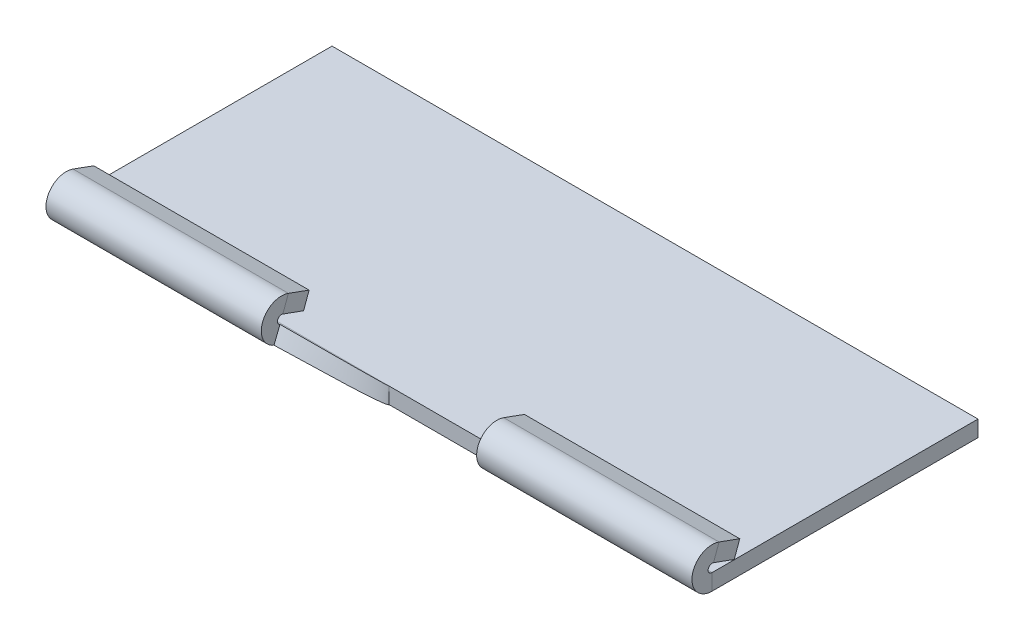
ISO-10303-21;
HEADER;
FILE_DESCRIPTION(('STEP AP214'),'2;1');
FILE_NAME('part.step','',(''),(''),'','','');
FILE_SCHEMA(('AUTOMOTIVE_DESIGN { 1 0 10303 214 1 1 1 1 }'));
ENDSEC;
DATA;
#1=APPLICATION_CONTEXT('core data for automotive mechanical design processes');
#2=APPLICATION_PROTOCOL_DEFINITION('international standard','automotive_design',2000,#1);
#3=PRODUCT_CONTEXT('',#1,'mechanical');
#4=PRODUCT('Part','Part','',(#3));
#5=PRODUCT_RELATED_PRODUCT_CATEGORY('part','',(#4));
#6=PRODUCT_DEFINITION_FORMATION('','',#4);
#7=PRODUCT_DEFINITION_CONTEXT('part definition',#1,'design');
#8=PRODUCT_DEFINITION('design','',#6,#7);
#9=PRODUCT_DEFINITION_SHAPE('','',#8);
#10=(LENGTH_UNIT() NAMED_UNIT(*) SI_UNIT(.MILLI.,.METRE.));
#11=(NAMED_UNIT(*) PLANE_ANGLE_UNIT() SI_UNIT($,.RADIAN.));
#12=(NAMED_UNIT(*) SI_UNIT($,.STERADIAN.) SOLID_ANGLE_UNIT());
#13=UNCERTAINTY_MEASURE_WITH_UNIT(LENGTH_MEASURE(1.E-05),#10,'distance_accuracy_value','');
#14=(GEOMETRIC_REPRESENTATION_CONTEXT(3) GLOBAL_UNCERTAINTY_ASSIGNED_CONTEXT((#13)) GLOBAL_UNIT_ASSIGNED_CONTEXT((#10,
#11,#12)) REPRESENTATION_CONTEXT('',''));
#15=CARTESIAN_POINT('',(0.,0.,0.));
#16=DIRECTION('',(0.,0.,1.));
#17=DIRECTION('',(1.,0.,0.));
#18=AXIS2_PLACEMENT_3D('',#15,#16,#17);
#19=CARTESIAN_POINT('',(0.,3.64863291385937,22.4635115383311));
#20=DIRECTION('',(0.,0.342020143325676,0.939692620785906));
#21=DIRECTION('',(1.,0.,0.));
#22=AXIS2_PLACEMENT_3D('',#19,#20,#21);
#23=PLANE('',#22);
#24=DIRECTION('',(1.,0.,0.));
#25=VECTOR('',#24,1.);
#26=CARTESIAN_POINT('',(0.,0.0684040286650639,23.7666082844019));
#27=LINE('',#26,#25);
#28=CARTESIAN_POINT('',(25.4,0.0684040286650639,23.7666082844019));
#29=VERTEX_POINT('',#28);
#30=CARTESIAN_POINT('',(76.2,0.0684040286650639,23.7666082844019));
#31=VERTEX_POINT('',#30);
#32=EDGE_CURVE('E246',#29,#31,#27,.T.);
#33=ORIENTED_EDGE('',*,*,#32,.F.);
#34=DIRECTION('',(0.,0.939692620785906,-0.342020143325676));
#35=VECTOR('',#34,1.);
#36=CARTESIAN_POINT('',(25.4,3.64863291385937,22.4635115383311));
#37=LINE('',#36,#35);
#38=CARTESIAN_POINT('',(25.4,3.64863291385937,22.4635115383311));
#39=VERTEX_POINT('',#38);
#40=EDGE_CURVE('E196',#39,#29,#37,.F.);
#41=ORIENTED_EDGE('',*,*,#40,.F.);
#42=DIRECTION('',(1.,0.,0.));
#43=VECTOR('',#42,1.);
#44=CARTESIAN_POINT('',(0.,3.64863291385937,22.4635115383311));
#45=LINE('',#44,#43);
#46=CARTESIAN_POINT('',(76.2,3.64863291385937,22.4635115383311));
#47=VERTEX_POINT('',#46);
#48=EDGE_CURVE('E232',#39,#47,#45,.T.);
#49=ORIENTED_EDGE('',*,*,#48,.T.);
#50=DIRECTION('',(0.,0.939692620785906,-0.342020143325676));
#51=VECTOR('',#50,1.);
#52=CARTESIAN_POINT('',(76.2,3.64863291385937,22.4635115383311));
#53=LINE('',#52,#51);
#54=EDGE_CURVE('E256',#31,#47,#53,.T.);
#55=ORIENTED_EDGE('',*,*,#54,.F.);
#56=EDGE_LOOP('',(#33,#41,#49,#55));
#57=FACE_BOUND('',#56,.T.);
#58=ADVANCED_FACE('F38',(#57),#23,.F.);
#59=CARTESIAN_POINT('',(-76.2,3.64863291385937,22.4635115383311));
#60=VERTEX_POINT('',#59);
#61=CARTESIAN_POINT('',(-25.4,3.64863291385937,22.4635115383311));
#62=VERTEX_POINT('',#61);
#63=EDGE_CURVE('E228',#60,#62,#45,.T.);
#64=ORIENTED_EDGE('',*,*,#63,.T.);
#65=DIRECTION('',(0.,0.939692620785906,-0.342020143325676));
#66=VECTOR('',#65,1.);
#67=CARTESIAN_POINT('',(-25.4,3.64863291385937,22.4635115383311));
#68=LINE('',#67,#66);
#69=CARTESIAN_POINT('',(-25.4,0.0684040286650639,23.7666082844019));
#70=VERTEX_POINT('',#69);
#71=EDGE_CURVE('E189',#62,#70,#68,.F.);
#72=ORIENTED_EDGE('',*,*,#71,.T.);
#73=CARTESIAN_POINT('',(-76.2,0.0684040286650639,23.7666082844019));
#74=VERTEX_POINT('',#73);
#75=EDGE_CURVE('E243',#74,#70,#27,.T.);
#76=ORIENTED_EDGE('',*,*,#75,.F.);
#77=DIRECTION('',(0.,0.939692620785906,-0.342020143325676));
#78=VECTOR('',#77,1.);
#79=CARTESIAN_POINT('',(-76.2,3.64863291385937,22.4635115383311));
#80=LINE('',#79,#78);
#81=EDGE_CURVE('E231',#74,#60,#80,.T.);
#82=ORIENTED_EDGE('',*,*,#81,.T.);
#83=EDGE_LOOP('',(#64,#72,#76,#82));
#84=FACE_BOUND('',#83,.T.);
#85=ADVANCED_FACE('F306',(#84),#23,.F.);
#86=CARTESIAN_POINT('',(0.,4.53820951017612,24.9076031495866));
#87=DIRECTION('',(0.,0.939692620785906,-0.342020143325676));
#88=DIRECTION('',(0.,0.342020143325676,0.939692620785906));
#89=AXIS2_PLACEMENT_3D('',#86,#87,#88);
#90=PLANE('',#89);
#91=ORIENTED_EDGE('',*,*,#48,.F.);
#92=DIRECTION('',(0.,-0.342020143325676,-0.939692620785906));
#93=VECTOR('',#92,1.);
#94=CARTESIAN_POINT('',(25.4,4.53820951017612,24.9076031495866));
#95=LINE('',#94,#93);
#96=CARTESIAN_POINT('',(25.4,5.42778610649288,27.3516947608421));
#97=VERTEX_POINT('',#96);
#98=EDGE_CURVE('E193',#97,#39,#95,.T.);
#99=ORIENTED_EDGE('',*,*,#98,.F.);
#100=DIRECTION('',(-1.,0.,0.));
#101=VECTOR('',#100,1.);
#102=CARTESIAN_POINT('',(0.,5.42778610649288,27.3516947608421));
#103=LINE('',#102,#101);
#104=CARTESIAN_POINT('',(76.2,5.42778610649288,27.3516947608421));
#105=VERTEX_POINT('',#104);
#106=EDGE_CURVE('E236',#105,#97,#103,.T.);
#107=ORIENTED_EDGE('',*,*,#106,.F.);
#108=DIRECTION('',(0.,0.342020143325676,0.939692620785906));
#109=VECTOR('',#108,1.);
#110=CARTESIAN_POINT('',(76.2,4.53820951017612,24.9076031495866));
#111=LINE('',#110,#109);
#112=EDGE_CURVE('E233',#47,#105,#111,.T.);
#113=ORIENTED_EDGE('',*,*,#112,.F.);
#114=EDGE_LOOP('',(#91,#99,#107,#113));
#115=FACE_BOUND('',#114,.T.);
#116=ADVANCED_FACE('F331',(#115),#90,.T.);
#117=CARTESIAN_POINT('',(-25.4,5.42778610649288,27.3516947608421));
#118=VERTEX_POINT('',#117);
#119=CARTESIAN_POINT('',(-76.1999999999999,5.42778610649288,27.3516947608421));
#120=VERTEX_POINT('',#119);
#121=EDGE_CURVE('E239',#118,#120,#103,.T.);
#122=ORIENTED_EDGE('',*,*,#121,.F.);
#123=DIRECTION('',(0.,0.342020143325676,0.939692620785906));
#124=VECTOR('',#123,1.);
#125=CARTESIAN_POINT('',(-25.4,4.53820951017612,24.9076031495866));
#126=LINE('',#125,#124);
#127=EDGE_CURVE('E182',#62,#118,#126,.T.);
#128=ORIENTED_EDGE('',*,*,#127,.F.);
#129=ORIENTED_EDGE('',*,*,#63,.F.);
#130=DIRECTION('',(0.,-0.342020143325676,-0.939692620785906));
#131=VECTOR('',#130,1.);
#132=CARTESIAN_POINT('',(-76.2,4.53820951017612,24.9076031495866));
#133=LINE('',#132,#131);
#134=EDGE_CURVE('E240',#120,#60,#133,.T.);
#135=ORIENTED_EDGE('',*,*,#134,.F.);
#136=EDGE_LOOP('',(#122,#128,#129,#135));
#137=FACE_BOUND('',#136,.T.);
#138=ADVANCED_FACE('F309',(#137),#90,.T.);
#139=CARTESIAN_POINT('',(0.,0.95798062498182,26.2106998956574));
#140=DIRECTION('',(0.,0.939692620785906,-0.342020143325676));
#141=DIRECTION('',(0.,0.342020143325676,0.939692620785906));
#142=AXIS2_PLACEMENT_3D('',#139,#140,#141);
#143=PLANE('',#142);
#144=DIRECTION('',(0.,0.342020143325676,0.939692620785906));
#145=VECTOR('',#144,1.);
#146=CARTESIAN_POINT('',(25.4,0.95798062498182,26.2106998956574));
#147=LINE('',#146,#145);
#148=CARTESIAN_POINT('',(25.4,1.84755722129858,28.654791506913));
#149=VERTEX_POINT('',#148);
#150=EDGE_CURVE('E186',#149,#29,#147,.F.);
#151=ORIENTED_EDGE('',*,*,#150,.T.);
#152=ORIENTED_EDGE('',*,*,#32,.T.);
#153=DIRECTION('',(0.,0.342020143325676,0.939692620785906));
#154=VECTOR('',#153,1.);
#155=CARTESIAN_POINT('',(76.2,0.95798062498182,26.2106998956574));
#156=LINE('',#155,#154);
#157=CARTESIAN_POINT('',(76.2,1.84755722129858,28.654791506913));
#158=VERTEX_POINT('',#157);
#159=EDGE_CURVE('E247',#31,#158,#156,.T.);
#160=ORIENTED_EDGE('',*,*,#159,.T.);
#161=DIRECTION('',(1.,0.,0.));
#162=VECTOR('',#161,1.);
#163=CARTESIAN_POINT('',(0.,1.84755722129858,28.654791506913));
#164=LINE('',#163,#162);
#165=EDGE_CURVE('E250',#158,#149,#164,.F.);
#166=ORIENTED_EDGE('',*,*,#165,.T.);
#167=EDGE_LOOP('',(#151,#152,#160,#166));
#168=FACE_BOUND('',#167,.T.);
#169=ADVANCED_FACE('F334',(#168),#143,.F.);
#170=DIRECTION('',(0.,0.342020143325676,0.939692620785906));
#171=VECTOR('',#170,1.);
#172=CARTESIAN_POINT('',(-25.4,0.95798062498182,26.2106998956574));
#173=LINE('',#172,#171);
#174=CARTESIAN_POINT('',(-25.4,1.84755722129858,28.654791506913));
#175=VERTEX_POINT('',#174);
#176=EDGE_CURVE('E190',#70,#175,#173,.T.);
#177=ORIENTED_EDGE('',*,*,#176,.T.);
#178=CARTESIAN_POINT('',(-76.2,1.84755722129858,28.654791506913));
#179=VERTEX_POINT('',#178);
#180=EDGE_CURVE('E253',#175,#179,#164,.F.);
#181=ORIENTED_EDGE('',*,*,#180,.T.);
#182=DIRECTION('',(0.,0.342020143325676,0.939692620785906));
#183=VECTOR('',#182,1.);
#184=CARTESIAN_POINT('',(-76.2,0.95798062498182,26.2106998956574));
#185=LINE('',#184,#183);
#186=EDGE_CURVE('E226',#179,#74,#185,.F.);
#187=ORIENTED_EDGE('',*,*,#186,.T.);
#188=ORIENTED_EDGE('',*,*,#75,.T.);
#189=EDGE_LOOP('',(#177,#181,#187,#188));
#190=FACE_BOUND('',#189,.T.);
#191=ADVANCED_FACE('F302',(#190),#143,.F.);
#192=CARTESIAN_POINT('',(76.2,0.952499999999996,28.9805656934307));
#193=DIRECTION('',(1.,0.,0.));
#194=DIRECTION('',(0.,0.939692620785906,-0.342020143325676));
#195=AXIS2_PLACEMENT_3D('',#192,#193,#194);
#196=CYLINDRICAL_SURFACE('',#195,4.76249999999999);
#197=ORIENTED_EDGE('',*,*,#106,.T.);
#198=CARTESIAN_POINT('',(25.4,0.952500000000002,28.9805656934307));
#199=DIRECTION('',(1.,0.,0.));
#200=DIRECTION('',(0.,0.,-1.));
#201=AXIS2_PLACEMENT_3D('',#198,#199,#200);
#202=CIRCLE('',#201,4.76249999999999);
#203=CARTESIAN_POINT('',(25.4,-3.80999999999999,28.9805656934307));
#204=VERTEX_POINT('',#203);
#205=EDGE_CURVE('E156',#204,#97,#202,.F.);
#206=ORIENTED_EDGE('',*,*,#205,.F.);
#207=DIRECTION('',(1.,0.,0.));
#208=VECTOR('',#207,1.);
#209=CARTESIAN_POINT('',(76.2,-3.80999999999999,28.9805656934307));
#210=LINE('',#209,#208);
#211=CARTESIAN_POINT('',(76.2,-3.81,28.9805656934307));
#212=VERTEX_POINT('',#211);
#213=EDGE_CURVE('E205',#212,#204,#210,.F.);
#214=ORIENTED_EDGE('',*,*,#213,.F.);
#215=CARTESIAN_POINT('',(76.2,0.952499999999996,28.9805656934307));
#216=DIRECTION('',(1.,0.,0.));
#217=DIRECTION('',(0.,1.,0.));
#218=AXIS2_PLACEMENT_3D('',#215,#216,#217);
#219=CIRCLE('',#218,4.76249999999999);
#220=EDGE_CURVE('E211',#105,#212,#219,.T.);
#221=ORIENTED_EDGE('',*,*,#220,.F.);
#222=EDGE_LOOP('',(#197,#206,#214,#221));
#223=FACE_BOUND('',#222,.T.);
#224=ADVANCED_FACE('F349',(#223),#196,.T.);
#225=CARTESIAN_POINT('',(-353.685308777106,0.952500000000045,28.9805656934307));
#226=DIRECTION('',(-0.0134641393973568,-0.999909354366829,0.));
#227=DIRECTION('',(0.999909354366829,-0.0134641393973568,0.));
#228=AXIS2_PLACEMENT_3D('',#225,#226,#227);
#229=ELLIPSE('',#228,353.717371712223,4.76249999999999);
#230=CARTESIAN_POINT('',(-25.4,-3.4679798566747,30.7527857945279));
#231=VERTEX_POINT('',#230);
#232=CARTESIAN_POINT('',(0.,-3.80999999999998,28.9805656934307));
#233=VERTEX_POINT('',#232);
#234=EDGE_CURVE('E160',#231,#233,#229,.F.);
#235=ORIENTED_EDGE('',*,*,#234,.F.);
#236=CARTESIAN_POINT('',(-25.4,0.952500000000007,28.9805656934307));
#237=DIRECTION('',(-1.,0.,0.));
#238=DIRECTION('',(0.,0.,1.));
#239=AXIS2_PLACEMENT_3D('',#236,#237,#238);
#240=CIRCLE('',#239,4.76249999999999);
#241=EDGE_CURVE('E145',#118,#231,#240,.F.);
#242=ORIENTED_EDGE('',*,*,#241,.F.);
#243=ORIENTED_EDGE('',*,*,#121,.T.);
#244=CARTESIAN_POINT('',(-76.1999999999999,0.952500000000013,28.9805656934307));
#245=DIRECTION('',(1.,0.,0.));
#246=DIRECTION('',(0.,1.,0.));
#247=AXIS2_PLACEMENT_3D('',#244,#245,#246);
#248=CIRCLE('',#247,4.76249999999999);
#249=CARTESIAN_POINT('',(-76.1999999999999,-3.80999999999998,28.9805656934307));
#250=VERTEX_POINT('',#249);
#251=EDGE_CURVE('E208',#250,#120,#248,.F.);
#252=ORIENTED_EDGE('',*,*,#251,.F.);
#253=EDGE_CURVE('E167',#233,#250,#210,.F.);
#254=ORIENTED_EDGE('',*,*,#253,.F.);
#255=EDGE_LOOP('',(#235,#242,#243,#252,#254));
#256=FACE_BOUND('',#255,.T.);
#257=ADVANCED_FACE('F165',(#256),#196,.T.);
#258=CARTESIAN_POINT('',(76.2,0.952499999999996,28.9805656934307));
#259=DIRECTION('',(1.,0.,0.));
#260=DIRECTION('',(0.,0.939692620785906,-0.342020143325676));
#261=AXIS2_PLACEMENT_3D('',#258,#259,#260);
#262=CYLINDRICAL_SURFACE('',#261,0.952499999999988);
#263=CARTESIAN_POINT('',(25.4,0.952500000000002,28.9805656934307));
#264=DIRECTION('',(1.,0.,0.));
#265=DIRECTION('',(0.,1.,0.));
#266=AXIS2_PLACEMENT_3D('',#263,#264,#265);
#267=CIRCLE('',#266,0.952499999999988);
#268=CARTESIAN_POINT('',(25.4,0.,28.9805656934307));
#269=VERTEX_POINT('',#268);
#270=EDGE_CURVE('E179',#269,#149,#267,.F.);
#271=ORIENTED_EDGE('',*,*,#270,.T.);
#272=ORIENTED_EDGE('',*,*,#165,.F.);
#273=CARTESIAN_POINT('',(76.2,0.952499999999996,28.9805656934307));
#274=DIRECTION('',(1.,0.,0.));
#275=DIRECTION('',(0.,1.,0.));
#276=AXIS2_PLACEMENT_3D('',#273,#274,#275);
#277=CIRCLE('',#276,0.952499999999988);
#278=CARTESIAN_POINT('',(76.2,0.,28.9805656934307));
#279=VERTEX_POINT('',#278);
#280=EDGE_CURVE('E202',#158,#279,#277,.T.);
#281=ORIENTED_EDGE('',*,*,#280,.T.);
#282=DIRECTION('',(1.,0.,0.));
#283=VECTOR('',#282,1.);
#284=CARTESIAN_POINT('',(76.2,0.,28.9805656934307));
#285=LINE('',#284,#283);
#286=EDGE_CURVE('E217',#279,#269,#285,.F.);
#287=ORIENTED_EDGE('',*,*,#286,.T.);
#288=EDGE_LOOP('',(#271,#272,#281,#287));
#289=FACE_BOUND('',#288,.T.);
#290=ADVANCED_FACE('F345',(#289),#262,.F.);
#291=CARTESIAN_POINT('',(-25.4,0.952500000000007,28.9805656934307));
#292=DIRECTION('',(1.,0.,0.));
#293=DIRECTION('',(0.,1.,0.));
#294=AXIS2_PLACEMENT_3D('',#291,#292,#293);
#295=CIRCLE('',#294,0.952499999999988);
#296=CARTESIAN_POINT('',(-25.4,0.0684040286650639,29.3350097136501));
#297=VERTEX_POINT('',#296);
#298=EDGE_CURVE('E183',#175,#297,#295,.T.);
#299=ORIENTED_EDGE('',*,*,#298,.T.);
#300=CARTESIAN_POINT('',(-353.685308777106,0.952500000000045,28.9805656934307));
#301=DIRECTION('',(-0.00269306222880419,-0.999996373701341,0.));
#302=DIRECTION('',(0.999996373701341,-0.00269306222880419,0.));
#303=AXIS2_PLACEMENT_3D('',#300,#301,#302);
#304=ELLIPSE('',#303,353.686591350312,0.952499999999988);
#305=CARTESIAN_POINT('',(-5.96744875736022E-12,0.,28.9805656934307));
#306=VERTEX_POINT('',#305);
#307=EDGE_CURVE('E162',#297,#306,#304,.F.);
#308=ORIENTED_EDGE('',*,*,#307,.T.);
#309=CARTESIAN_POINT('',(-76.1999999999999,0.,28.9805656934307));
#310=VERTEX_POINT('',#309);
#311=EDGE_CURVE('E220',#306,#310,#285,.F.);
#312=ORIENTED_EDGE('',*,*,#311,.T.);
#313=CARTESIAN_POINT('',(-76.1999999999999,0.952500000000013,28.9805656934307));
#314=DIRECTION('',(1.,0.,0.));
#315=DIRECTION('',(0.,1.,0.));
#316=AXIS2_PLACEMENT_3D('',#313,#314,#315);
#317=CIRCLE('',#316,0.952499999999988);
#318=EDGE_CURVE('E214',#310,#179,#317,.F.);
#319=ORIENTED_EDGE('',*,*,#318,.T.);
#320=ORIENTED_EDGE('',*,*,#180,.F.);
#321=EDGE_LOOP('',(#299,#308,#312,#319,#320));
#322=FACE_BOUND('',#321,.T.);
#323=ADVANCED_FACE('F297',(#322),#262,.F.);
#324=CARTESIAN_POINT('',(76.2,-3.81,-33.7430656934307));
#325=DIRECTION('',(1.,0.,0.));
#326=DIRECTION('',(0.,0.,-1.));
#327=AXIS2_PLACEMENT_3D('',#324,#325,#326);
#328=PLANE('',#327);
#329=DIRECTION('',(0.,0.,-1.));
#330=VECTOR('',#329,1.);
#331=CARTESIAN_POINT('',(76.2,0.,-33.7430656934307));
#332=LINE('',#331,#330);
#333=CARTESIAN_POINT('',(76.2,0.,-33.7430656934307));
#334=VERTEX_POINT('',#333);
#335=EDGE_CURVE('E265',#279,#334,#332,.T.);
#336=ORIENTED_EDGE('',*,*,#335,.F.);
#337=DIRECTION('',(0.,-1.,0.));
#338=VECTOR('',#337,1.);
#339=CARTESIAN_POINT('',(76.2,0.,28.9805656934307));
#340=LINE('',#339,#338);
#341=EDGE_CURVE('E61',#279,#212,#340,.T.);
#342=ORIENTED_EDGE('',*,*,#341,.T.);
#343=DIRECTION('',(0.,0.,-1.));
#344=VECTOR('',#343,1.);
#345=CARTESIAN_POINT('',(76.2,-3.81,-33.7430656934307));
#346=LINE('',#345,#344);
#347=CARTESIAN_POINT('',(76.2,-3.81,-33.7430656934307));
#348=VERTEX_POINT('',#347);
#349=EDGE_CURVE('E267',#212,#348,#346,.T.);
#350=ORIENTED_EDGE('',*,*,#349,.T.);
#351=DIRECTION('',(0.,1.,0.));
#352=VECTOR('',#351,1.);
#353=CARTESIAN_POINT('',(76.2,-3.81,-33.7430656934307));
#354=LINE('',#353,#352);
#355=EDGE_CURVE('E42',#348,#334,#354,.T.);
#356=ORIENTED_EDGE('',*,*,#355,.T.);
#357=EDGE_LOOP('',(#336,#342,#350,#356));
#358=FACE_BOUND('',#357,.T.);
#359=ADVANCED_FACE('F40',(#358),#328,.T.);
#360=CARTESIAN_POINT('',(-76.2,-3.81,-33.7430656934307));
#361=DIRECTION('',(-1.,0.,0.));
#362=DIRECTION('',(0.,0.,1.));
#363=AXIS2_PLACEMENT_3D('',#360,#361,#362);
#364=PLANE('',#363);
#365=DIRECTION('',(0.,-1.,0.));
#366=VECTOR('',#365,1.);
#367=CARTESIAN_POINT('',(-76.1999999999999,0.,28.9805656934307));
#368=LINE('',#367,#366);
#369=EDGE_CURVE('E223',#310,#250,#368,.T.);
#370=ORIENTED_EDGE('',*,*,#369,.F.);
#371=DIRECTION('',(0.,0.,1.));
#372=VECTOR('',#371,1.);
#373=CARTESIAN_POINT('',(-76.2,0.,-33.7430656934307));
#374=LINE('',#373,#372);
#375=CARTESIAN_POINT('',(-76.2,0.,-33.7430656934307));
#376=VERTEX_POINT('',#375);
#377=EDGE_CURVE('E270',#376,#310,#374,.T.);
#378=ORIENTED_EDGE('',*,*,#377,.F.);
#379=DIRECTION('',(0.,1.,0.));
#380=VECTOR('',#379,1.);
#381=CARTESIAN_POINT('',(-76.2,-3.81,-33.7430656934307));
#382=LINE('',#381,#380);
#383=CARTESIAN_POINT('',(-76.2,-3.81,-33.7430656934307));
#384=VERTEX_POINT('',#383);
#385=EDGE_CURVE('E12',#384,#376,#382,.T.);
#386=ORIENTED_EDGE('',*,*,#385,.F.);
#387=DIRECTION('',(0.,0.,1.));
#388=VECTOR('',#387,1.);
#389=CARTESIAN_POINT('',(-76.2,-3.81,-33.7430656934307));
#390=LINE('',#389,#388);
#391=EDGE_CURVE('E273',#384,#250,#390,.T.);
#392=ORIENTED_EDGE('',*,*,#391,.T.);
#393=EDGE_LOOP('',(#370,#378,#386,#392));
#394=FACE_BOUND('',#393,.T.);
#395=ADVANCED_FACE('F290',(#394),#364,.T.);
#396=CARTESIAN_POINT('',(-76.2,-3.81,-33.7430656934307));
#397=DIRECTION('',(0.,0.,-1.));
#398=DIRECTION('',(-1.,0.,0.));
#399=AXIS2_PLACEMENT_3D('',#396,#397,#398);
#400=PLANE('',#399);
#401=DIRECTION('',(-1.,0.,0.));
#402=VECTOR('',#401,1.);
#403=CARTESIAN_POINT('',(-76.2,0.,-33.7430656934307));
#404=LINE('',#403,#402);
#405=EDGE_CURVE('E277',#334,#376,#404,.T.);
#406=ORIENTED_EDGE('',*,*,#405,.F.);
#407=ORIENTED_EDGE('',*,*,#355,.F.);
#408=DIRECTION('',(-1.,0.,0.));
#409=VECTOR('',#408,1.);
#410=CARTESIAN_POINT('',(-76.2,-3.81,-33.7430656934307));
#411=LINE('',#410,#409);
#412=EDGE_CURVE('E269',#348,#384,#411,.T.);
#413=ORIENTED_EDGE('',*,*,#412,.T.);
#414=ORIENTED_EDGE('',*,*,#385,.T.);
#415=EDGE_LOOP('',(#406,#407,#413,#414));
#416=FACE_BOUND('',#415,.T.);
#417=ADVANCED_FACE('F431',(#416),#400,.T.);
#418=CARTESIAN_POINT('',(0.,-3.81,0.));
#419=DIRECTION('',(0.,1.,0.));
#420=DIRECTION('',(0.,0.,1.));
#421=AXIS2_PLACEMENT_3D('',#418,#419,#420);
#422=PLANE('',#421);
#423=ORIENTED_EDGE('',*,*,#349,.F.);
#424=ORIENTED_EDGE('',*,*,#213,.T.);
#425=DIRECTION('',(1.,0.,0.));
#426=VECTOR('',#425,1.);
#427=CARTESIAN_POINT('',(76.2,-3.80999999999999,28.9805656934307));
#428=LINE('',#427,#426);
#429=EDGE_CURVE('E169',#204,#233,#428,.F.);
#430=ORIENTED_EDGE('',*,*,#429,.T.);
#431=ORIENTED_EDGE('',*,*,#253,.T.);
#432=ORIENTED_EDGE('',*,*,#391,.F.);
#433=ORIENTED_EDGE('',*,*,#412,.F.);
#434=EDGE_LOOP('',(#423,#424,#430,#431,#432,#433));
#435=FACE_BOUND('',#434,.T.);
#436=ADVANCED_FACE('F448',(#435),#422,.F.);
#437=CARTESIAN_POINT('',(0.,0.,0.));
#438=DIRECTION('',(0.,1.,0.));
#439=DIRECTION('',(0.,0.,1.));
#440=AXIS2_PLACEMENT_3D('',#437,#438,#439);
#441=PLANE('',#440);
#442=ORIENTED_EDGE('',*,*,#286,.F.);
#443=ORIENTED_EDGE('',*,*,#335,.T.);
#444=ORIENTED_EDGE('',*,*,#405,.T.);
#445=ORIENTED_EDGE('',*,*,#377,.T.);
#446=ORIENTED_EDGE('',*,*,#311,.F.);
#447=DIRECTION('',(1.,0.,0.));
#448=VECTOR('',#447,1.);
#449=CARTESIAN_POINT('',(76.2,0.,28.9805656934307));
#450=LINE('',#449,#448);
#451=EDGE_CURVE('E173',#269,#306,#450,.F.);
#452=ORIENTED_EDGE('',*,*,#451,.F.);
#453=EDGE_LOOP('',(#442,#443,#444,#445,#446,#452));
#454=FACE_BOUND('',#453,.T.);
#455=ADVANCED_FACE('F285',(#454),#441,.T.);
#456=CARTESIAN_POINT('',(76.2,4.53820951017612,24.9076031495866));
#457=DIRECTION('',(-1.,0.,0.));
#458=DIRECTION('',(0.,0.342020143325676,0.939692620785906));
#459=AXIS2_PLACEMENT_3D('',#456,#457,#458);
#460=PLANE('',#459);
#461=DIRECTION('',(0.,0.939692620785906,-0.342020143325676));
#462=VECTOR('',#461,1.);
#463=CARTESIAN_POINT('',(76.2,5.42778610649288,27.3516947608421));
#464=LINE('',#463,#462);
#465=EDGE_CURVE('E259',#158,#105,#464,.T.);
#466=ORIENTED_EDGE('',*,*,#465,.F.);
#467=ORIENTED_EDGE('',*,*,#159,.F.);
#468=ORIENTED_EDGE('',*,*,#54,.T.);
#469=ORIENTED_EDGE('',*,*,#112,.T.);
#470=EDGE_LOOP('',(#466,#467,#468,#469));
#471=FACE_BOUND('',#470,.T.);
#472=ADVANCED_FACE('F314',(#471),#460,.F.);
#473=CARTESIAN_POINT('',(-76.2,4.53820951017612,24.9076031495866));
#474=DIRECTION('',(1.,0.,0.));
#475=DIRECTION('',(0.,-0.342020143325676,-0.939692620785906));
#476=AXIS2_PLACEMENT_3D('',#473,#474,#475);
#477=PLANE('',#476);
#478=ORIENTED_EDGE('',*,*,#186,.F.);
#479=DIRECTION('',(0.,0.939692620785906,-0.342020143325676));
#480=VECTOR('',#479,1.);
#481=CARTESIAN_POINT('',(-76.2,5.42778610649288,27.3516947608421));
#482=LINE('',#481,#480);
#483=EDGE_CURVE('E262',#179,#120,#482,.T.);
#484=ORIENTED_EDGE('',*,*,#483,.T.);
#485=ORIENTED_EDGE('',*,*,#134,.T.);
#486=ORIENTED_EDGE('',*,*,#81,.F.);
#487=EDGE_LOOP('',(#478,#484,#485,#486));
#488=FACE_BOUND('',#487,.T.);
#489=ADVANCED_FACE('F312',(#488),#477,.F.);
#490=CARTESIAN_POINT('',(-76.1999999999999,0.952500000000013,28.9805656934307));
#491=DIRECTION('',(-1.,0.,0.));
#492=DIRECTION('',(0.,-1.,0.));
#493=AXIS2_PLACEMENT_3D('',#490,#491,#492);
#494=PLANE('',#493);
#495=ORIENTED_EDGE('',*,*,#483,.F.);
#496=ORIENTED_EDGE('',*,*,#318,.F.);
#497=ORIENTED_EDGE('',*,*,#369,.T.);
#498=ORIENTED_EDGE('',*,*,#251,.T.);
#499=EDGE_LOOP('',(#495,#496,#497,#498));
#500=FACE_BOUND('',#499,.T.);
#501=ADVANCED_FACE('F294',(#500),#494,.T.);
#502=CARTESIAN_POINT('',(76.2,0.952499999999996,28.9805656934307));
#503=DIRECTION('',(-1.,0.,0.));
#504=DIRECTION('',(0.,-1.,0.));
#505=AXIS2_PLACEMENT_3D('',#502,#503,#504);
#506=PLANE('',#505);
#507=ORIENTED_EDGE('',*,*,#280,.F.);
#508=ORIENTED_EDGE('',*,*,#465,.T.);
#509=ORIENTED_EDGE('',*,*,#220,.T.);
#510=ORIENTED_EDGE('',*,*,#341,.F.);
#511=EDGE_LOOP('',(#507,#508,#509,#510));
#512=FACE_BOUND('',#511,.T.);
#513=ADVANCED_FACE('F320',(#512),#506,.F.);
#514=CARTESIAN_POINT('',(25.4,4.53820951017612,24.9076031495866));
#515=DIRECTION('',(1.,0.,0.));
#516=DIRECTION('',(0.,-0.342020143325676,-0.939692620785906));
#517=AXIS2_PLACEMENT_3D('',#514,#515,#516);
#518=PLANE('',#517);
#519=DIRECTION('',(0.,0.939692620785906,-0.342020143325676));
#520=VECTOR('',#519,1.);
#521=CARTESIAN_POINT('',(25.4,5.42778610649288,27.3516947608421));
#522=LINE('',#521,#520);
#523=EDGE_CURVE('E198',#97,#149,#522,.F.);
#524=ORIENTED_EDGE('',*,*,#523,.F.);
#525=ORIENTED_EDGE('',*,*,#98,.T.);
#526=ORIENTED_EDGE('',*,*,#40,.T.);
#527=ORIENTED_EDGE('',*,*,#150,.F.);
#528=EDGE_LOOP('',(#524,#525,#526,#527));
#529=FACE_BOUND('',#528,.T.);
#530=ADVANCED_FACE('F342',(#529),#518,.F.);
#531=CARTESIAN_POINT('',(-25.4,4.53820951017612,24.9076031495866));
#532=DIRECTION('',(-1.,0.,0.));
#533=DIRECTION('',(0.,0.342020143325676,0.939692620785906));
#534=AXIS2_PLACEMENT_3D('',#531,#532,#533);
#535=PLANE('',#534);
#536=ORIENTED_EDGE('',*,*,#127,.T.);
#537=DIRECTION('',(0.,0.939692620785906,-0.342020143325676));
#538=VECTOR('',#537,1.);
#539=CARTESIAN_POINT('',(-25.4,5.42778610649288,27.3516947608421));
#540=LINE('',#539,#538);
#541=EDGE_CURVE('E151',#118,#175,#540,.F.);
#542=ORIENTED_EDGE('',*,*,#541,.T.);
#543=ORIENTED_EDGE('',*,*,#176,.F.);
#544=ORIENTED_EDGE('',*,*,#71,.F.);
#545=EDGE_LOOP('',(#536,#542,#543,#544));
#546=FACE_BOUND('',#545,.T.);
#547=ADVANCED_FACE('F299',(#546),#535,.F.);
#548=CARTESIAN_POINT('',(25.4,0.952500000000002,28.9805656934307));
#549=DIRECTION('',(-1.,0.,0.));
#550=DIRECTION('',(0.,0.,1.));
#551=AXIS2_PLACEMENT_3D('',#548,#549,#550);
#552=PLANE('',#551);
#553=ORIENTED_EDGE('',*,*,#205,.T.);
#554=ORIENTED_EDGE('',*,*,#523,.T.);
#555=ORIENTED_EDGE('',*,*,#270,.F.);
#556=DIRECTION('',(0.,1.,0.));
#557=VECTOR('',#556,1.);
#558=CARTESIAN_POINT('',(25.4,0.,28.9805656934307));
#559=LINE('',#558,#557);
#560=EDGE_CURVE('E157',#269,#204,#559,.F.);
#561=ORIENTED_EDGE('',*,*,#560,.T.);
#562=EDGE_LOOP('',(#553,#554,#555,#561));
#563=FACE_BOUND('',#562,.T.);
#564=ADVANCED_FACE('F355',(#563),#552,.T.);
#565=CARTESIAN_POINT('',(-25.4,0.952500000000007,28.9805656934307));
#566=DIRECTION('',(1.,0.,0.));
#567=DIRECTION('',(0.,0.,-1.));
#568=AXIS2_PLACEMENT_3D('',#565,#566,#567);
#569=PLANE('',#568);
#570=ORIENTED_EDGE('',*,*,#241,.T.);
#571=DIRECTION('',(0.,0.928184746808339,-0.372119706267135));
#572=VECTOR('',#571,1.);
#573=CARTESIAN_POINT('',(-25.4,0.0684040286650639,29.3350097136501));
#574=LINE('',#573,#572);
#575=EDGE_CURVE('E148',#297,#231,#574,.F.);
#576=ORIENTED_EDGE('',*,*,#575,.F.);
#577=ORIENTED_EDGE('',*,*,#298,.F.);
#578=ORIENTED_EDGE('',*,*,#541,.F.);
#579=EDGE_LOOP('',(#570,#576,#577,#578));
#580=FACE_BOUND('',#579,.T.);
#581=ADVANCED_FACE('F147',(#580),#569,.T.);
#582=CARTESIAN_POINT('',(12.7,0.,28.9805656934307));
#583=DIRECTION('',(0.,0.,-1.));
#584=DIRECTION('',(1.,0.,0.));
#585=AXIS2_PLACEMENT_3D('',#582,#583,#584);
#586=PLANE('',#585);
#587=ORIENTED_EDGE('',*,*,#560,.F.);
#588=ORIENTED_EDGE('',*,*,#451,.T.);
#589=DIRECTION('',(0.,1.,0.));
#590=VECTOR('',#589,1.);
#591=CARTESIAN_POINT('',(0.,0.,28.9805656934307));
#592=LINE('',#591,#590);
#593=EDGE_CURVE('E53',#306,#233,#592,.F.);
#594=ORIENTED_EDGE('',*,*,#593,.T.);
#595=ORIENTED_EDGE('',*,*,#429,.F.);
#596=EDGE_LOOP('',(#587,#588,#594,#595));
#597=FACE_BOUND('',#596,.T.);
#598=ADVANCED_FACE('F361',(#597),#586,.F.);
#599=CARTESIAN_POINT('',(-5.60662627435704E-12,-3.80999999999998,28.9805656934307));
#600=CARTESIAN_POINT('',(-5.73615229389664E-12,-2.53999999999998,28.9805656934307));
#601=CARTESIAN_POINT('',(-5.86567831343624E-12,-1.26999999999998,28.9805656934307));
#602=CARTESIAN_POINT('',(-5.99520433297585E-12,0.,28.9805656934307));
#603=CARTESIAN_POINT('',(-5.60662627435704E-12,-3.80999999999998,19.4555656934307));
#604=CARTESIAN_POINT('',(-5.73615229389664E-12,-2.53999999999998,21.9955656934307));
#605=CARTESIAN_POINT('',(-5.86567831343625E-12,-1.26999999999998,24.5355656934307));
#606=CARTESIAN_POINT('',(-5.99520433297585E-12,0.,27.0755656934307));
#607=CARTESIAN_POINT('',(-707.370617554207,5.71500000000007,19.4555656934307));
#608=CARTESIAN_POINT('',(-707.370617554207,4.44500000000007,21.9955656934307));
#609=CARTESIAN_POINT('',(-707.370617554207,3.17500000000007,24.5355656934307));
#610=CARTESIAN_POINT('',(-707.370617554206,1.90500000000007,27.0755656934307));
#611=CARTESIAN_POINT('',(-707.370617554207,5.71500000000007,28.9805656934307));
#612=CARTESIAN_POINT('',(-707.370617554206,4.44500000000007,28.9805656934307));
#613=CARTESIAN_POINT('',(-707.370617554206,3.17500000000007,28.9805656934307));
#614=CARTESIAN_POINT('',(-707.370617554206,1.90500000000007,28.9805656934307));
#615=CARTESIAN_POINT('',(-707.370617554206,5.71500000000007,38.5055656934306));
#616=CARTESIAN_POINT('',(-707.370617554206,4.44500000000007,35.9655656934306));
#617=CARTESIAN_POINT('',(-707.370617554206,3.17500000000007,33.4255656934306));
#618=CARTESIAN_POINT('',(-707.370617554206,1.90500000000007,30.8855656934306));
#619=CARTESIAN_POINT('',(-5.60662627435704E-12,-3.80999999999998,38.5055656934306));
#620=CARTESIAN_POINT('',(-5.73615229389664E-12,-2.53999999999998,35.9655656934306));
#621=CARTESIAN_POINT('',(-5.86567831343625E-12,-1.26999999999998,33.4255656934306));
#622=CARTESIAN_POINT('',(-5.99520433297585E-12,0.,30.8855656934306));
#623=CARTESIAN_POINT('',(-5.60662627435704E-12,-3.80999999999998,28.9805656934307));
#624=CARTESIAN_POINT('',(-5.73615229389664E-12,-2.53999999999998,28.9805656934307));
#625=CARTESIAN_POINT('',(-5.86567831343624E-12,-1.26999999999998,28.9805656934307));
#626=CARTESIAN_POINT('',(-5.99520433297585E-12,0.,28.9805656934307));
#627=(BOUNDED_SURFACE() B_SPLINE_SURFACE(3,3,((#599,#600,#601,#602),(#603,#604,#605,#606),(#607,
#608,#609,#610),(#611,#612,#613,#614),(#615,#616,#617,#618),(#619,#620,#621,#622),(#623,#624,
#625,#626)),.UNSPECIFIED.,.T.,.F.,.F.) B_SPLINE_SURFACE_WITH_KNOTS((4,3,4),(4,4),(0.,0.5,1.),
(0.,1.),.UNSPECIFIED.) GEOMETRIC_REPRESENTATION_ITEM() RATIONAL_B_SPLINE_SURFACE(((1.,1.,1.,1.),
(0.333333333333333,0.333333333333333,0.333333333333333,0.333333333333333),(0.333333333333333,
0.333333333333333,0.333333333333333,0.333333333333333),(1.,1.,1.,1.),(0.333333333333333,
0.333333333333333,0.333333333333333,0.333333333333333),(0.333333333333333,0.333333333333333,
0.333333333333333,0.333333333333333),(1.,1.,1.,1.))) REPRESENTATION_ITEM('') SURFACE());
#628=ORIENTED_EDGE('',*,*,#593,.F.);
#629=ORIENTED_EDGE('',*,*,#307,.F.);
#630=ORIENTED_EDGE('',*,*,#575,.T.);
#631=ORIENTED_EDGE('',*,*,#234,.T.);
#632=EDGE_LOOP('',(#628,#629,#630,#631));
#633=FACE_BOUND('',#632,.T.);
#634=ADVANCED_FACE('F159',(#633),#627,.T.);
#635=CLOSED_SHELL('',(#58,#85,#116,#138,#169,#191,#224,#257,#290,#323,#359,#395,#417,#436,#455,
#472,#489,#501,#513,#530,#547,#564,#581,#598,#634));
#636=MANIFOLD_SOLID_BREP('B2',#635);
#637=ADVANCED_BREP_SHAPE_REPRESENTATION('',(#18,#636),#14);
#638=SHAPE_DEFINITION_REPRESENTATION(#9,#637);
ENDSEC;
END-ISO-10303-21;
